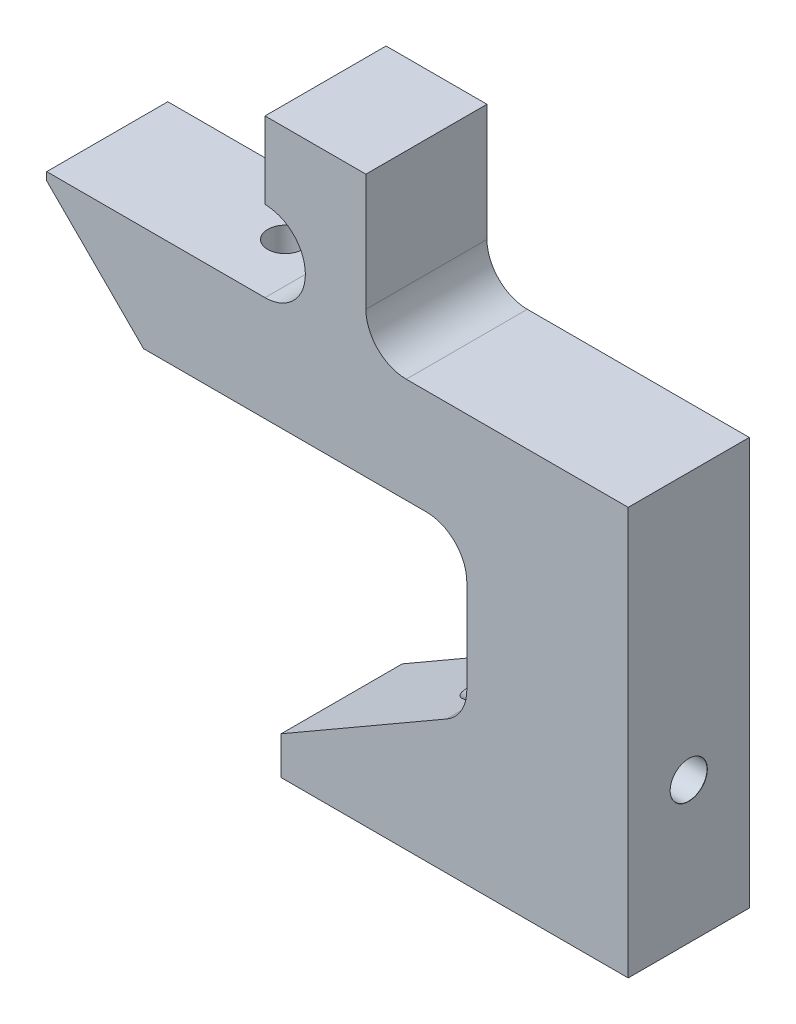
ISO-10303-21;
HEADER;
FILE_DESCRIPTION(('STEP AP214'),'2;1');
FILE_NAME('part.step','',(''),(''),'','','');
FILE_SCHEMA(('AUTOMOTIVE_DESIGN { 1 0 10303 214 1 1 1 1 }'));
ENDSEC;
DATA;
#1=APPLICATION_CONTEXT('core data for automotive mechanical design processes');
#2=APPLICATION_PROTOCOL_DEFINITION('international standard','automotive_design',2000,#1);
#3=PRODUCT_CONTEXT('',#1,'mechanical');
#4=PRODUCT('Part','Part','',(#3));
#5=PRODUCT_RELATED_PRODUCT_CATEGORY('part','',(#4));
#6=PRODUCT_DEFINITION_FORMATION('','',#4);
#7=PRODUCT_DEFINITION_CONTEXT('part definition',#1,'design');
#8=PRODUCT_DEFINITION('design','',#6,#7);
#9=PRODUCT_DEFINITION_SHAPE('','',#8);
#10=(LENGTH_UNIT() NAMED_UNIT(*) SI_UNIT(.MILLI.,.METRE.));
#11=(NAMED_UNIT(*) PLANE_ANGLE_UNIT() SI_UNIT($,.RADIAN.));
#12=(NAMED_UNIT(*) SI_UNIT($,.STERADIAN.) SOLID_ANGLE_UNIT());
#13=UNCERTAINTY_MEASURE_WITH_UNIT(LENGTH_MEASURE(1.E-05),#10,'distance_accuracy_value','');
#14=(GEOMETRIC_REPRESENTATION_CONTEXT(3) GLOBAL_UNCERTAINTY_ASSIGNED_CONTEXT((#13)) GLOBAL_UNIT_ASSIGNED_CONTEXT((#10,
#11,#12)) REPRESENTATION_CONTEXT('',''));
#15=CARTESIAN_POINT('',(0.,0.,0.));
#16=DIRECTION('',(0.,0.,1.));
#17=DIRECTION('',(1.,0.,0.));
#18=AXIS2_PLACEMENT_3D('',#15,#16,#17);
#19=CARTESIAN_POINT('',(82.55,26.035,9.525));
#20=DIRECTION('',(0.,-1.,0.));
#21=DIRECTION('',(1.,0.,0.));
#22=AXIS2_PLACEMENT_3D('',#19,#20,#21);
#23=PLANE('',#22);
#24=CARTESIAN_POINT('',(19.05,26.035,0.));
#25=DIRECTION('',(0.,-1.,0.));
#26=DIRECTION('',(1.,0.,0.));
#27=AXIS2_PLACEMENT_3D('',#24,#25,#26);
#28=CIRCLE('',#27,2.74999999999999);
#29=CARTESIAN_POINT('',(21.8,26.035,0.));
#30=VERTEX_POINT('',#29);
#31=EDGE_CURVE('E53',#30,#30,#28,.T.);
#32=ORIENTED_EDGE('',*,*,#31,.T.);
#33=EDGE_LOOP('',(#32));
#34=FACE_BOUND('',#33,.T.);
#35=DIRECTION('',(-1.,0.,0.));
#36=VECTOR('',#35,1.);
#37=CARTESIAN_POINT('',(82.55,26.035,9.525));
#38=LINE('',#37,#36);
#39=CARTESIAN_POINT('',(25.4,26.035,9.525));
#40=VERTEX_POINT('',#39);
#41=CARTESIAN_POINT('',(-8.94721186379732,26.035,9.525));
#42=VERTEX_POINT('',#41);
#43=EDGE_CURVE('E215',#40,#42,#38,.T.);
#44=ORIENTED_EDGE('',*,*,#43,.F.);
#45=DIRECTION('',(0.,0.,1.));
#46=VECTOR('',#45,1.);
#47=CARTESIAN_POINT('',(25.4,26.035,-38.9413364476272));
#48=LINE('',#47,#46);
#49=CARTESIAN_POINT('',(25.4,26.035,-9.525));
#50=VERTEX_POINT('',#49);
#51=EDGE_CURVE('E214',#50,#40,#48,.T.);
#52=ORIENTED_EDGE('',*,*,#51,.F.);
#53=DIRECTION('',(-1.,0.,0.));
#54=VECTOR('',#53,1.);
#55=CARTESIAN_POINT('',(82.55,26.035,-9.525));
#56=LINE('',#55,#54);
#57=CARTESIAN_POINT('',(-8.94721186379732,26.035,-9.525));
#58=VERTEX_POINT('',#57);
#59=EDGE_CURVE('E197',#50,#58,#56,.T.);
#60=ORIENTED_EDGE('',*,*,#59,.T.);
#61=DIRECTION('',(0.,0.,-1.));
#62=VECTOR('',#61,1.);
#63=CARTESIAN_POINT('',(-8.94721186379732,26.035,9.525));
#64=LINE('',#63,#62);
#65=EDGE_CURVE('E446',#42,#58,#64,.T.);
#66=ORIENTED_EDGE('',*,*,#65,.F.);
#67=EDGE_LOOP('',(#44,#52,#60,#66));
#68=FACE_BOUND('',#67,.T.);
#69=ADVANCED_FACE('F49',(#34,#68),#23,.F.);
#70=CARTESIAN_POINT('',(6.29278813620283,9.525,9.525));
#71=DIRECTION('',(0.,1.,0.));
#72=DIRECTION('',(0.,0.,1.));
#73=AXIS2_PLACEMENT_3D('',#70,#71,#72);
#74=PLANE('',#73);
#75=CARTESIAN_POINT('',(19.05,9.525,0.));
#76=DIRECTION('',(0.,-1.,0.));
#77=DIRECTION('',(0.,0.,-1.));
#78=AXIS2_PLACEMENT_3D('',#75,#76,#77);
#79=CIRCLE('',#78,5.025);
#80=CARTESIAN_POINT('',(19.05,9.525,-5.025));
#81=VERTEX_POINT('',#80);
#82=EDGE_CURVE('E437',#81,#81,#79,.T.);
#83=ORIENTED_EDGE('',*,*,#82,.F.);
#84=EDGE_LOOP('',(#83));
#85=FACE_BOUND('',#84,.T.);
#86=DIRECTION('',(1.,0.,0.));
#87=VECTOR('',#86,1.);
#88=CARTESIAN_POINT('',(0.,9.525,-6.35));
#89=LINE('',#88,#87);
#90=CARTESIAN_POINT('',(6.29278813620283,9.525,-6.34999999999999));
#91=VERTEX_POINT('',#90);
#92=CARTESIAN_POINT('',(50.8,9.525,-6.34999999999999));
#93=VERTEX_POINT('',#92);
#94=EDGE_CURVE('E265',#91,#93,#89,.T.);
#95=ORIENTED_EDGE('',*,*,#94,.T.);
#96=DIRECTION('',(0.,0.,-1.));
#97=VECTOR('',#96,1.);
#98=CARTESIAN_POINT('',(50.8,9.525,9.525));
#99=LINE('',#98,#97);
#100=CARTESIAN_POINT('',(50.8,9.525,9.525));
#101=VERTEX_POINT('',#100);
#102=EDGE_CURVE('E452',#101,#93,#99,.T.);
#103=ORIENTED_EDGE('',*,*,#102,.F.);
#104=DIRECTION('',(1.,0.,0.));
#105=VECTOR('',#104,1.);
#106=CARTESIAN_POINT('',(6.29278813620283,9.525,9.525));
#107=LINE('',#106,#105);
#108=CARTESIAN_POINT('',(6.29278813620283,9.525,9.525));
#109=VERTEX_POINT('',#108);
#110=EDGE_CURVE('E462',#109,#101,#107,.T.);
#111=ORIENTED_EDGE('',*,*,#110,.F.);
#112=DIRECTION('',(0.,0.,-1.));
#113=VECTOR('',#112,1.);
#114=CARTESIAN_POINT('',(6.29278813620283,9.525,9.525));
#115=LINE('',#114,#113);
#116=EDGE_CURVE('E457',#109,#91,#115,.T.);
#117=ORIENTED_EDGE('',*,*,#116,.T.);
#118=EDGE_LOOP('',(#95,#103,#111,#117));
#119=FACE_BOUND('',#118,.T.);
#120=ADVANCED_FACE('F354',(#85,#119),#74,.F.);
#121=CARTESIAN_POINT('',(50.8,3.175,9.525));
#122=DIRECTION('',(0.,0.,-1.));
#123=DIRECTION('',(-1.,0.,0.));
#124=AXIS2_PLACEMENT_3D('',#121,#122,#123);
#125=CYLINDRICAL_SURFACE('',#124,6.35);
#126=CARTESIAN_POINT('',(50.8,3.175,-6.35));
#127=DIRECTION('',(0.,0.,-1.));
#128=DIRECTION('',(-1.,0.,0.));
#129=AXIS2_PLACEMENT_3D('',#126,#127,#128);
#130=CIRCLE('',#129,6.35);
#131=CARTESIAN_POINT('',(57.15,3.175,-6.34999999999999));
#132=VERTEX_POINT('',#131);
#133=EDGE_CURVE('E268',#93,#132,#130,.T.);
#134=ORIENTED_EDGE('',*,*,#133,.T.);
#135=DIRECTION('',(0.,0.,-1.));
#136=VECTOR('',#135,1.);
#137=CARTESIAN_POINT('',(57.15,3.175,9.525));
#138=LINE('',#137,#136);
#139=CARTESIAN_POINT('',(57.15,3.175,9.525));
#140=VERTEX_POINT('',#139);
#141=EDGE_CURVE('E458',#140,#132,#138,.T.);
#142=ORIENTED_EDGE('',*,*,#141,.F.);
#143=CARTESIAN_POINT('',(50.8,3.175,9.525));
#144=DIRECTION('',(0.,0.,-1.));
#145=DIRECTION('',(-1.,0.,0.));
#146=AXIS2_PLACEMENT_3D('',#143,#144,#145);
#147=CIRCLE('',#146,6.35);
#148=EDGE_CURVE('E466',#101,#140,#147,.T.);
#149=ORIENTED_EDGE('',*,*,#148,.F.);
#150=ORIENTED_EDGE('',*,*,#102,.T.);
#151=EDGE_LOOP('',(#134,#142,#149,#150));
#152=FACE_BOUND('',#151,.T.);
#153=ADVANCED_FACE('F362',(#152),#125,.F.);
#154=CARTESIAN_POINT('',(50.8,-11.593094792873,9.525));
#155=DIRECTION('',(0.,0.,-1.));
#156=DIRECTION('',(-1.,0.,0.));
#157=AXIS2_PLACEMENT_3D('',#154,#155,#156);
#158=CYLINDRICAL_SURFACE('',#157,6.35);
#159=CARTESIAN_POINT('',(53.975,-17.0923561069042,4.60428608570136));
#160=CARTESIAN_POINT('',(54.1113508766374,-17.0136414045933,4.62508964887516));
#161=CARTESIAN_POINT('',(54.2448913914641,-16.9297730828273,4.64511225366183));
#162=CARTESIAN_POINT('',(54.5058268645094,-16.751997878483,4.6819390500378));
#163=CARTESIAN_POINT('',(54.6332137589857,-16.6580783163095,4.69873910002061));
#164=CARTESIAN_POINT('',(54.8818400642926,-16.4599753567673,4.72750376481506));
#165=CARTESIAN_POINT('',(55.003029721475,-16.3557241746457,4.73943340216922));
#166=CARTESIAN_POINT('',(55.2374048178985,-16.1381445523192,4.75647541852492));
#167=CARTESIAN_POINT('',(55.35059476805,-16.0248213058547,4.76159166900556));
#168=CARTESIAN_POINT('',(55.5463264474944,-15.8134362028541,4.76302846466305));
#169=CARTESIAN_POINT('',(55.63046672208,-15.7168621875559,4.7609051129015));
#170=CARTESIAN_POINT('',(55.7925866764744,-15.519024406963,4.75021009038339));
#171=CARTESIAN_POINT('',(55.8705677154356,-15.4177616841881,4.74163984667382));
#172=CARTESIAN_POINT('',(56.0196758943345,-15.2116050865912,4.71720819506649));
#173=CARTESIAN_POINT('',(56.0908230061625,-15.1067230909921,4.70136886662639));
#174=CARTESIAN_POINT('',(56.226094755376,-14.8939858242828,4.66162241297098));
#175=CARTESIAN_POINT('',(56.2902194939784,-14.7861305960554,4.63771540405945));
#176=CARTESIAN_POINT('',(56.4115757674052,-14.5677281511387,4.58096849410895));
#177=CARTESIAN_POINT('',(56.4687496606463,-14.4571665022745,4.54806040002896));
#178=CARTESIAN_POINT('',(56.5754116495449,-14.2354894555281,4.4729302555646));
#179=CARTESIAN_POINT('',(56.6248996425662,-14.1243740502716,4.43070808081975));
#180=CARTESIAN_POINT('',(56.7161808387424,-13.9029960870149,4.33671183072896));
#181=CARTESIAN_POINT('',(56.7579726750404,-13.7927336838348,4.2849360619031));
#182=CARTESIAN_POINT('',(56.8340477039572,-13.5745379665484,4.17185512711184));
#183=CARTESIAN_POINT('',(56.8683315315639,-13.4666044561731,4.11055076777488));
#184=CARTESIAN_POINT('',(56.9264952668409,-13.2658985662237,3.98577731950784));
#185=CARTESIAN_POINT('',(56.9510981150687,-13.1727455703258,3.92325300113739));
#186=CARTESIAN_POINT('',(56.9950956957228,-12.9902709148279,3.79109986904151));
#187=CARTESIAN_POINT('',(57.0144882843248,-12.9009508449946,3.72146814709996));
#188=CARTESIAN_POINT('',(57.0485801618721,-12.7269440695261,3.57548014176961));
#189=CARTESIAN_POINT('',(57.063276399359,-12.6422604058874,3.49911952721115));
#190=CARTESIAN_POINT('',(57.0885466129999,-12.4782867137482,3.34017718422799));
#191=CARTESIAN_POINT('',(57.0991203897732,-12.3989969462736,3.2575951551383));
#192=CARTESIAN_POINT('',(57.1163699495852,-12.2498666873862,3.09059466462463));
#193=CARTESIAN_POINT('',(57.1232004809615,-12.1797609557093,3.00642843981754));
#194=CARTESIAN_POINT('',(57.1342262156432,-12.0454423071342,2.83335401028897));
#195=CARTESIAN_POINT('',(57.13842134248,-11.9812295612723,2.74444566805201));
#196=CARTESIAN_POINT('',(57.1447154769834,-11.8592079938995,2.56257298808015));
#197=CARTESIAN_POINT('',(57.1468193381599,-11.8013846224067,2.46961856697297));
#198=CARTESIAN_POINT('',(57.1494582485168,-11.692271159258,2.27995037574595));
#199=CARTESIAN_POINT('',(57.1499935732039,-11.6409799217751,2.18323726884723));
#200=CARTESIAN_POINT('',(57.15,-11.593094792873,2.08487266929629));
#201=B_SPLINE_CURVE_WITH_KNOTS('',3,(#159,#160,#161,#162,#163,#164,#165,#166,#167,#168,#169,
#170,#171,#172,#173,#174,#175,#176,#177,#178,#179,#180,#181,#182,#183,#184,#185,#186,#187,#188,
#189,#190,#191,#192,#193,#194,#195,#196,#197,#198,#199,#200),.UNSPECIFIED.,.F.,.F.,(4,2,2,2,2,2,
2,2,2,2,2,2,2,2,2,2,2,2,2,2,4),(0.,0.476379772374912,0.953367742047326,1.43372342640456,
1.91380604809174,2.29775745889993,2.68162390542814,3.06433201743873,3.44703461255936,
3.83272099070913,4.21841251880887,4.60417248077879,4.98989980458882,5.33407069164746,
5.6783829758579,6.02291852454581,6.36747073444755,6.696430247589,7.02539930533709,
7.35360308069951,7.68174920503093),.UNSPECIFIED.);
#202=CARTESIAN_POINT('',(53.975,-17.0923561069042,4.60428608570136));
#203=VERTEX_POINT('',#202);
#204=CARTESIAN_POINT('',(57.15,-11.593094792873,2.08487266929633));
#205=VERTEX_POINT('',#204);
#206=EDGE_CURVE('E307',#203,#205,#201,.T.);
#207=ORIENTED_EDGE('',*,*,#206,.F.);
#208=DIRECTION('',(0.,0.,-1.));
#209=VECTOR('',#208,1.);
#210=CARTESIAN_POINT('',(53.975,-17.0923561069042,9.525));
#211=LINE('',#210,#209);
#212=CARTESIAN_POINT('',(53.975,-17.0923561069042,9.525));
#213=VERTEX_POINT('',#212);
#214=EDGE_CURVE('E494',#213,#203,#211,.T.);
#215=ORIENTED_EDGE('',*,*,#214,.F.);
#216=CARTESIAN_POINT('',(50.8,-11.593094792873,9.525));
#217=DIRECTION('',(0.,0.,-1.));
#218=DIRECTION('',(-1.,0.,0.));
#219=AXIS2_PLACEMENT_3D('',#216,#217,#218);
#220=CIRCLE('',#219,6.35);
#221=CARTESIAN_POINT('',(57.15,-11.593094792873,9.525));
#222=VERTEX_POINT('',#221);
#223=EDGE_CURVE('E504',#222,#213,#220,.T.);
#224=ORIENTED_EDGE('',*,*,#223,.F.);
#225=DIRECTION('',(0.,0.,-1.));
#226=VECTOR('',#225,1.);
#227=CARTESIAN_POINT('',(57.15,-11.593094792873,9.525));
#228=LINE('',#227,#226);
#229=EDGE_CURVE('E481',#222,#205,#228,.T.);
#230=ORIENTED_EDGE('',*,*,#229,.T.);
#231=EDGE_LOOP('',(#207,#215,#224,#230));
#232=FACE_BOUND('',#231,.T.);
#233=ADVANCED_FACE('F313',(#232),#158,.F.);
#234=CARTESIAN_POINT('',(57.15,-11.593094792873,-2.08487266929629));
#235=CARTESIAN_POINT('',(57.1499896079638,-11.6477036663434,-2.19706000854487));
#236=CARTESIAN_POINT('',(57.149295442611,-11.7067505495997,-2.30709883615113));
#237=CARTESIAN_POINT('',(57.1457738852113,-11.8332961099778,-2.52221696693255));
#238=CARTESIAN_POINT('',(57.1429457661744,-11.9007976608766,-2.62729456696358));
#239=CARTESIAN_POINT('',(57.1343772320195,-12.0439969425765,-2.83204549306916));
#240=CARTESIAN_POINT('',(57.1286284313238,-12.1197177767795,-2.93170233840411));
#241=CARTESIAN_POINT('',(57.1133939144072,-12.2786067084437,-3.1245747462868));
#242=CARTESIAN_POINT('',(57.1039086507198,-12.3617739031131,-3.21779108725592));
#243=CARTESIAN_POINT('',(57.0803422398971,-12.5351551675311,-3.39742198609998));
#244=CARTESIAN_POINT('',(57.0662456746826,-12.6253920946448,-3.48381250154185));
#245=CARTESIAN_POINT('',(57.0326737025964,-12.8118004687659,-3.64879482459787));
#246=CARTESIAN_POINT('',(57.0131986386591,-12.9079715371075,-3.72738712899368));
#247=CARTESIAN_POINT('',(56.9682029671152,-13.105035044801,-3.87606811093338));
#248=CARTESIAN_POINT('',(56.9426946275755,-13.2059175740881,-3.94617361383919));
#249=CARTESIAN_POINT('',(56.8850298855865,-13.4114166067748,-4.07762639548657));
#250=CARTESIAN_POINT('',(56.8528740234818,-13.5160328061112,-4.13897438539856));
#251=CARTESIAN_POINT('',(56.7837993636749,-13.7209030425351,-4.24898938784659));
#252=CARTESIAN_POINT('',(56.7473205959476,-13.8210041883582,-4.29821858822719));
#253=CARTESIAN_POINT('',(56.667991249007,-14.0222666730337,-4.388730959138));
#254=CARTESIAN_POINT('',(56.6251407773086,-14.1234279939702,-4.43001426371868));
#255=CARTESIAN_POINT('',(56.5330307643795,-14.3257142433685,-4.50474723452688));
#256=CARTESIAN_POINT('',(56.4837714841317,-14.4268391731441,-4.53819721959182));
#257=CARTESIAN_POINT('',(56.3789415530392,-14.6280210493351,-4.59754832087161));
#258=CARTESIAN_POINT('',(56.3233708178056,-14.7280779814509,-4.62344933613449));
#259=CARTESIAN_POINT('',(56.2072051739229,-14.9243711737376,-4.66772436778048));
#260=CARTESIAN_POINT('',(56.1467204143452,-15.0206438347441,-4.68622707799075));
#261=CARTESIAN_POINT('',(56.0201375267892,-15.2105094311678,-4.71689631806553));
#262=CARTESIAN_POINT('',(55.9540373588998,-15.3041013761087,-4.72906053379707));
#263=CARTESIAN_POINT('',(55.8164373546782,-15.4881018931541,-4.74766096999691));
#264=CARTESIAN_POINT('',(55.7449270649016,-15.5785037805681,-4.75408577746614));
#265=CARTESIAN_POINT('',(55.5969704685222,-15.7554114050622,-4.76182187389247));
#266=CARTESIAN_POINT('',(55.5205232138835,-15.8419163883809,-4.76313217773545));
#267=CARTESIAN_POINT('',(55.3341426601427,-16.0415685182146,-4.76098271199396));
#268=CARTESIAN_POINT('',(55.2222163043403,-16.1528425293162,-4.75559591355604));
#269=CARTESIAN_POINT('',(54.9906261357071,-16.3665643544675,-4.73827779863016));
#270=CARTESIAN_POINT('',(54.8709575192208,-16.469006595147,-4.7263423840558));
#271=CARTESIAN_POINT('',(54.6253315513067,-16.6639723997066,-4.69772225277613));
#272=CARTESIAN_POINT('',(54.4994083562844,-16.7565426640819,-4.68106139941843));
#273=CARTESIAN_POINT('',(54.2415651757743,-16.931860831255,-4.64461374801886));
#274=CARTESIAN_POINT('',(54.1096531502128,-17.0146212728601,-4.6248310174482));
#275=CARTESIAN_POINT('',(53.975,-17.0923561069042,-4.60428608570135));
#276=B_SPLINE_CURVE_WITH_KNOTS('',3,(#234,#235,#236,#237,#238,#239,#240,#241,#242,#243,#244,
#245,#246,#247,#248,#249,#250,#251,#252,#253,#254,#255,#256,#257,#258,#259,#260,#261,#262,#263,
#264,#265,#266,#267,#268,#269,#270,#271,#272,#273,#274,#275),.UNSPECIFIED.,.F.,.F.,(4,2,2,2,2,2,
2,2,2,2,2,2,2,2,2,2,2,2,2,2,4),(0.,0.374235461788785,0.748598474752093,1.12404244831308,
1.49944096476456,1.87610769504882,2.25275041451625,2.6286337546583,3.00448655309735,
3.35613717554868,3.70778186499156,4.05941223904992,4.41104731522638,4.75626757537123,
5.10161378448363,5.44764520681056,5.79374327560947,6.26685501178745,6.74026315682248,
7.21132191576781,7.68177192717215),.UNSPECIFIED.);
#277=CARTESIAN_POINT('',(57.15,-11.593094792873,-2.08487266929633));
#278=VERTEX_POINT('',#277);
#279=CARTESIAN_POINT('',(53.975,-17.0923561069042,-4.60428608570135));
#280=VERTEX_POINT('',#279);
#281=EDGE_CURVE('E298',#278,#280,#276,.T.);
#282=ORIENTED_EDGE('',*,*,#281,.F.);
#283=CARTESIAN_POINT('',(57.15,-11.593094792873,-9.525));
#284=VERTEX_POINT('',#283);
#285=EDGE_CURVE('E499',#278,#284,#228,.T.);
#286=ORIENTED_EDGE('',*,*,#285,.T.);
#287=CARTESIAN_POINT('',(50.8,-11.593094792873,-9.525));
#288=DIRECTION('',(0.,0.,-1.));
#289=DIRECTION('',(-1.,0.,0.));
#290=AXIS2_PLACEMENT_3D('',#287,#288,#289);
#291=CIRCLE('',#290,6.35);
#292=CARTESIAN_POINT('',(53.975,-17.0923561069042,-9.525));
#293=VERTEX_POINT('',#292);
#294=EDGE_CURVE('E521',#284,#293,#291,.T.);
#295=ORIENTED_EDGE('',*,*,#294,.T.);
#296=EDGE_CURVE('E500',#280,#293,#211,.T.);
#297=ORIENTED_EDGE('',*,*,#296,.F.);
#298=EDGE_LOOP('',(#282,#286,#295,#297));
#299=FACE_BOUND('',#298,.T.);
#300=ADVANCED_FACE('F675',(#299),#158,.F.);
#301=CARTESIAN_POINT('',(27.94,-38.1,9.525));
#302=DIRECTION('',(0.,1.,0.));
#303=DIRECTION('',(0.,0.,1.));
#304=AXIS2_PLACEMENT_3D('',#301,#302,#303);
#305=PLANE('',#304);
#306=DIRECTION('',(1.,0.,0.));
#307=VECTOR('',#306,1.);
#308=CARTESIAN_POINT('',(27.94,-38.1,-9.525));
#309=LINE('',#308,#307);
#310=CARTESIAN_POINT('',(27.94,-38.1,-9.525));
#311=VERTEX_POINT('',#310);
#312=CARTESIAN_POINT('',(82.55,-38.1,-9.525));
#313=VERTEX_POINT('',#312);
#314=EDGE_CURVE('E535',#311,#313,#309,.T.);
#315=ORIENTED_EDGE('',*,*,#314,.T.);
#316=DIRECTION('',(0.,0.,-1.));
#317=VECTOR('',#316,1.);
#318=CARTESIAN_POINT('',(82.55,-38.1,9.525));
#319=LINE('',#318,#317);
#320=CARTESIAN_POINT('',(82.55,-38.1,9.525));
#321=VERTEX_POINT('',#320);
#322=EDGE_CURVE('E399',#321,#313,#319,.T.);
#323=ORIENTED_EDGE('',*,*,#322,.F.);
#324=DIRECTION('',(1.,0.,0.));
#325=VECTOR('',#324,1.);
#326=CARTESIAN_POINT('',(27.94,-38.1,9.525));
#327=LINE('',#326,#325);
#328=CARTESIAN_POINT('',(27.94,-38.1,9.525));
#329=VERTEX_POINT('',#328);
#330=EDGE_CURVE('E550',#329,#321,#327,.T.);
#331=ORIENTED_EDGE('',*,*,#330,.F.);
#332=DIRECTION('',(0.,0.,-1.));
#333=VECTOR('',#332,1.);
#334=CARTESIAN_POINT('',(27.94,-38.1,9.525));
#335=LINE('',#334,#333);
#336=EDGE_CURVE('E560',#329,#311,#335,.T.);
#337=ORIENTED_EDGE('',*,*,#336,.T.);
#338=EDGE_LOOP('',(#315,#323,#331,#337));
#339=FACE_BOUND('',#338,.T.);
#340=ADVANCED_FACE('F378',(#339),#305,.F.);
#341=CARTESIAN_POINT('',(82.55,-38.1,9.525));
#342=DIRECTION('',(-1.,0.,0.));
#343=DIRECTION('',(0.,0.,1.));
#344=AXIS2_PLACEMENT_3D('',#341,#342,#343);
#345=PLANE('',#344);
#346=CARTESIAN_POINT('',(82.55,-15.875,0.));
#347=DIRECTION('',(1.,0.,0.));
#348=DIRECTION('',(0.,0.,-1.));
#349=AXIS2_PLACEMENT_3D('',#346,#347,#348);
#350=CIRCLE('',#349,2.925);
#351=CARTESIAN_POINT('',(82.55,-15.875,-2.925));
#352=VERTEX_POINT('',#351);
#353=EDGE_CURVE('E492',#352,#352,#350,.T.);
#354=ORIENTED_EDGE('',*,*,#353,.F.);
#355=EDGE_LOOP('',(#354));
#356=FACE_BOUND('',#355,.T.);
#357=DIRECTION('',(0.,1.,0.));
#358=VECTOR('',#357,1.);
#359=CARTESIAN_POINT('',(82.55,-38.1,-9.525));
#360=LINE('',#359,#358);
#361=CARTESIAN_POINT('',(82.55,26.035,-9.525));
#362=VERTEX_POINT('',#361);
#363=EDGE_CURVE('E211',#313,#362,#360,.T.);
#364=ORIENTED_EDGE('',*,*,#363,.T.);
#365=DIRECTION('',(0.,0.,-1.));
#366=VECTOR('',#365,1.);
#367=CARTESIAN_POINT('',(82.55,26.035,9.525));
#368=LINE('',#367,#366);
#369=CARTESIAN_POINT('',(82.55,26.035,9.525));
#370=VERTEX_POINT('',#369);
#371=EDGE_CURVE('E388',#370,#362,#368,.T.);
#372=ORIENTED_EDGE('',*,*,#371,.F.);
#373=DIRECTION('',(0.,1.,0.));
#374=VECTOR('',#373,1.);
#375=CARTESIAN_POINT('',(82.55,-38.1,9.525));
#376=LINE('',#375,#374);
#377=EDGE_CURVE('E555',#321,#370,#376,.T.);
#378=ORIENTED_EDGE('',*,*,#377,.F.);
#379=ORIENTED_EDGE('',*,*,#322,.T.);
#380=EDGE_LOOP('',(#364,#372,#378,#379));
#381=FACE_BOUND('',#380,.T.);
#382=ADVANCED_FACE('F370',(#356,#381),#345,.F.);
#383=CARTESIAN_POINT('',(47.625,26.035,-9.525));
#384=VERTEX_POINT('',#383);
#385=EDGE_CURVE('E210',#362,#384,#56,.T.);
#386=ORIENTED_EDGE('',*,*,#385,.T.);
#387=DIRECTION('',(0.,0.,1.));
#388=VECTOR('',#387,1.);
#389=CARTESIAN_POINT('',(47.625,26.035,9.525));
#390=LINE('',#389,#388);
#391=CARTESIAN_POINT('',(47.625,26.035,9.525));
#392=VERTEX_POINT('',#391);
#393=EDGE_CURVE('E386',#384,#392,#390,.T.);
#394=ORIENTED_EDGE('',*,*,#393,.T.);
#395=EDGE_CURVE('E585',#370,#392,#38,.T.);
#396=ORIENTED_EDGE('',*,*,#395,.F.);
#397=ORIENTED_EDGE('',*,*,#371,.T.);
#398=EDGE_LOOP('',(#386,#394,#396,#397));
#399=FACE_BOUND('',#398,.T.);
#400=ADVANCED_FACE('F357',(#399),#23,.F.);
#401=CARTESIAN_POINT('',(-8.94721186379732,26.035,9.525));
#402=DIRECTION('',(1.,0.,0.));
#403=DIRECTION('',(0.,1.,0.));
#404=AXIS2_PLACEMENT_3D('',#401,#402,#403);
#405=PLANE('',#404);
#406=DIRECTION('',(0.,-1.,0.));
#407=VECTOR('',#406,1.);
#408=CARTESIAN_POINT('',(-8.94721186379732,26.035,-9.525));
#409=LINE('',#408,#407);
#410=CARTESIAN_POINT('',(-8.94721186379732,24.765,-9.525));
#411=VERTEX_POINT('',#410);
#412=EDGE_CURVE('E205',#58,#411,#409,.T.);
#413=ORIENTED_EDGE('',*,*,#412,.T.);
#414=DIRECTION('',(0.,0.,-1.));
#415=VECTOR('',#414,1.);
#416=CARTESIAN_POINT('',(-8.94721186379732,24.765,9.525));
#417=LINE('',#416,#415);
#418=CARTESIAN_POINT('',(-8.94721186379732,24.765,9.525));
#419=VERTEX_POINT('',#418);
#420=EDGE_CURVE('E473',#419,#411,#417,.T.);
#421=ORIENTED_EDGE('',*,*,#420,.F.);
#422=DIRECTION('',(0.,-1.,0.));
#423=VECTOR('',#422,1.);
#424=CARTESIAN_POINT('',(-8.94721186379732,26.035,9.525));
#425=LINE('',#424,#423);
#426=EDGE_CURVE('E589',#42,#419,#425,.T.);
#427=ORIENTED_EDGE('',*,*,#426,.F.);
#428=ORIENTED_EDGE('',*,*,#65,.T.);
#429=EDGE_LOOP('',(#413,#421,#427,#428));
#430=FACE_BOUND('',#429,.T.);
#431=ADVANCED_FACE('F369',(#430),#405,.F.);
#432=CARTESIAN_POINT('',(-8.94721186379732,24.765,9.525));
#433=DIRECTION('',(0.707106781186544,0.707106781186551,0.));
#434=DIRECTION('',(-0.707106781186551,0.707106781186544,0.));
#435=AXIS2_PLACEMENT_3D('',#432,#433,#434);
#436=PLANE('',#435);
#437=DIRECTION('',(0.707106781186551,-0.707106781186544,0.));
#438=VECTOR('',#437,1.);
#439=CARTESIAN_POINT('',(-8.94721186379732,24.765,-9.525));
#440=LINE('',#439,#438);
#441=CARTESIAN_POINT('',(8.83278813620267,6.985,-9.52500000000001));
#442=VERTEX_POINT('',#441);
#443=EDGE_CURVE('E594',#411,#442,#440,.T.);
#444=ORIENTED_EDGE('',*,*,#443,.T.);
#445=DIRECTION('',(0.,0.,1.));
#446=VECTOR('',#445,1.);
#447=CARTESIAN_POINT('',(8.83278813620267,6.985,-61.1533652516633));
#448=LINE('',#447,#446);
#449=CARTESIAN_POINT('',(8.83278813620267,6.985,-6.35));
#450=VERTEX_POINT('',#449);
#451=EDGE_CURVE('E259',#442,#450,#448,.T.);
#452=ORIENTED_EDGE('',*,*,#451,.T.);
#453=DIRECTION('',(-0.707106781186525,0.70710678118657,0.));
#454=VECTOR('',#453,1.);
#455=CARTESIAN_POINT('',(7.90889406810161,7.90889406810112,-6.35));
#456=LINE('',#455,#454);
#457=EDGE_CURVE('E261',#450,#91,#456,.T.);
#458=ORIENTED_EDGE('',*,*,#457,.T.);
#459=ORIENTED_EDGE('',*,*,#116,.F.);
#460=DIRECTION('',(0.707106781186551,-0.707106781186544,0.));
#461=VECTOR('',#460,1.);
#462=CARTESIAN_POINT('',(-8.94721186379732,24.765,9.525));
#463=LINE('',#462,#461);
#464=EDGE_CURVE('E467',#419,#109,#463,.T.);
#465=ORIENTED_EDGE('',*,*,#464,.F.);
#466=ORIENTED_EDGE('',*,*,#420,.T.);
#467=EDGE_LOOP('',(#444,#452,#458,#459,#465,#466));
#468=FACE_BOUND('',#467,.T.);
#469=ADVANCED_FACE('F350',(#468),#436,.F.);
#470=CARTESIAN_POINT('',(57.15,3.175,9.525));
#471=DIRECTION('',(1.,0.,0.));
#472=DIRECTION('',(0.,0.,-1.));
#473=AXIS2_PLACEMENT_3D('',#470,#471,#472);
#474=PLANE('',#473);
#475=DIRECTION('',(0.,-1.,0.));
#476=VECTOR('',#475,1.);
#477=CARTESIAN_POINT('',(57.15,1.56125112837913E-13,-6.35));
#478=LINE('',#477,#476);
#479=CARTESIAN_POINT('',(57.15,0.635000000000004,-6.35));
#480=VERTEX_POINT('',#479);
#481=EDGE_CURVE('E271',#132,#480,#478,.T.);
#482=ORIENTED_EDGE('',*,*,#481,.T.);
#483=DIRECTION('',(0.,0.,1.));
#484=VECTOR('',#483,1.);
#485=CARTESIAN_POINT('',(57.15,0.635000000000004,-61.1533652516633));
#486=LINE('',#485,#484);
#487=CARTESIAN_POINT('',(57.15,0.635000000000004,-9.525));
#488=VERTEX_POINT('',#487);
#489=EDGE_CURVE('E287',#488,#480,#486,.T.);
#490=ORIENTED_EDGE('',*,*,#489,.F.);
#491=DIRECTION('',(0.,-1.,0.));
#492=VECTOR('',#491,1.);
#493=CARTESIAN_POINT('',(57.15,3.175,-9.525));
#494=LINE('',#493,#492);
#495=EDGE_CURVE('E527',#488,#284,#494,.T.);
#496=ORIENTED_EDGE('',*,*,#495,.T.);
#497=ORIENTED_EDGE('',*,*,#285,.F.);
#498=CARTESIAN_POINT('',(57.15,-15.875,0.));
#499=DIRECTION('',(1.,0.,0.));
#500=DIRECTION('',(0.,0.,-1.));
#501=AXIS2_PLACEMENT_3D('',#498,#499,#500);
#502=CIRCLE('',#501,4.7625);
#503=EDGE_CURVE('E282',#205,#278,#502,.T.);
#504=ORIENTED_EDGE('',*,*,#503,.F.);
#505=ORIENTED_EDGE('',*,*,#229,.F.);
#506=DIRECTION('',(0.,-1.,0.));
#507=VECTOR('',#506,1.);
#508=CARTESIAN_POINT('',(57.15,3.175,9.525));
#509=LINE('',#508,#507);
#510=EDGE_CURVE('E486',#140,#222,#509,.T.);
#511=ORIENTED_EDGE('',*,*,#510,.F.);
#512=ORIENTED_EDGE('',*,*,#141,.T.);
#513=EDGE_LOOP('',(#482,#490,#496,#497,#504,#505,#511,#512));
#514=FACE_BOUND('',#513,.T.);
#515=CARTESIAN_POINT('',(57.15,-15.875,0.));
#516=DIRECTION('',(1.,0.,0.));
#517=DIRECTION('',(0.,0.,-1.));
#518=AXIS2_PLACEMENT_3D('',#515,#516,#517);
#519=CIRCLE('',#518,2.89999999999998);
#520=CARTESIAN_POINT('',(57.15,-15.875,-2.89999999999998));
#521=VERTEX_POINT('',#520);
#522=EDGE_CURVE('E297',#521,#521,#519,.F.);
#523=ORIENTED_EDGE('',*,*,#522,.F.);
#524=EDGE_LOOP('',(#523));
#525=FACE_BOUND('',#524,.T.);
#526=ADVANCED_FACE('F344',(#514,#525),#474,.F.);
#527=CARTESIAN_POINT('',(53.975,-17.0923561069042,9.525));
#528=DIRECTION('',(0.500000000000001,-0.866025403784438,0.));
#529=DIRECTION('',(0.866025403784438,0.500000000000001,0.));
#530=AXIS2_PLACEMENT_3D('',#527,#528,#529);
#531=PLANE('',#530);
#532=CARTESIAN_POINT('',(56.0835226280623,-15.875,0.));
#533=DIRECTION('',(0.500000000000001,-0.866025403784438,0.));
#534=DIRECTION('',(-0.866025403784438,-0.500000000000001,0.));
#535=AXIS2_PLACEMENT_3D('',#532,#533,#534);
#536=ELLIPSE('',#535,9.52499999999998,4.7625);
#537=EDGE_CURVE('E393',#280,#203,#536,.F.);
#538=ORIENTED_EDGE('',*,*,#537,.F.);
#539=ORIENTED_EDGE('',*,*,#296,.T.);
#540=DIRECTION('',(-0.866025403784438,-0.500000000000001,0.));
#541=VECTOR('',#540,1.);
#542=CARTESIAN_POINT('',(53.975,-17.0923561069042,-9.525));
#543=LINE('',#542,#541);
#544=CARTESIAN_POINT('',(27.94,-32.1236703652562,-9.525));
#545=VERTEX_POINT('',#544);
#546=EDGE_CURVE('E526',#293,#545,#543,.T.);
#547=ORIENTED_EDGE('',*,*,#546,.T.);
#548=DIRECTION('',(0.,0.,-1.));
#549=VECTOR('',#548,1.);
#550=CARTESIAN_POINT('',(27.94,-32.1236703652562,9.525));
#551=LINE('',#550,#549);
#552=CARTESIAN_POINT('',(27.94,-32.1236703652562,9.525));
#553=VERTEX_POINT('',#552);
#554=EDGE_CURVE('E533',#553,#545,#551,.T.);
#555=ORIENTED_EDGE('',*,*,#554,.F.);
#556=DIRECTION('',(-0.866025403784438,-0.500000000000001,0.));
#557=VECTOR('',#556,1.);
#558=CARTESIAN_POINT('',(53.975,-17.0923561069042,9.525));
#559=LINE('',#558,#557);
#560=EDGE_CURVE('E508',#213,#553,#559,.T.);
#561=ORIENTED_EDGE('',*,*,#560,.F.);
#562=ORIENTED_EDGE('',*,*,#214,.T.);
#563=EDGE_LOOP('',(#538,#539,#547,#555,#561,#562));
#564=FACE_BOUND('',#563,.T.);
#565=ADVANCED_FACE('F341',(#564),#531,.F.);
#566=CARTESIAN_POINT('',(27.94,-32.1236703652562,9.525));
#567=DIRECTION('',(1.,0.,0.));
#568=DIRECTION('',(0.,1.,0.));
#569=AXIS2_PLACEMENT_3D('',#566,#567,#568);
#570=PLANE('',#569);
#571=DIRECTION('',(0.,-1.,0.));
#572=VECTOR('',#571,1.);
#573=CARTESIAN_POINT('',(27.94,-32.1236703652562,-9.525));
#574=LINE('',#573,#572);
#575=EDGE_CURVE('E556',#545,#311,#574,.T.);
#576=ORIENTED_EDGE('',*,*,#575,.T.);
#577=ORIENTED_EDGE('',*,*,#336,.F.);
#578=DIRECTION('',(0.,-1.,0.));
#579=VECTOR('',#578,1.);
#580=CARTESIAN_POINT('',(27.94,-32.1236703652562,9.525));
#581=LINE('',#580,#579);
#582=EDGE_CURVE('E565',#553,#329,#581,.T.);
#583=ORIENTED_EDGE('',*,*,#582,.F.);
#584=ORIENTED_EDGE('',*,*,#554,.T.);
#585=EDGE_LOOP('',(#576,#577,#583,#584));
#586=FACE_BOUND('',#585,.T.);
#587=ADVANCED_FACE('F337',(#586),#570,.F.);
#588=CARTESIAN_POINT('',(50.8,3.175,9.525));
#589=DIRECTION('',(0.,0.,-1.));
#590=DIRECTION('',(-1.,0.,0.));
#591=AXIS2_PLACEMENT_3D('',#588,#589,#590);
#592=PLANE('',#591);
#593=ORIENTED_EDGE('',*,*,#330,.T.);
#594=ORIENTED_EDGE('',*,*,#377,.T.);
#595=ORIENTED_EDGE('',*,*,#395,.T.);
#596=CARTESIAN_POINT('',(47.625,32.385,9.525));
#597=DIRECTION('',(0.,0.,-1.));
#598=DIRECTION('',(-1.,0.,0.));
#599=AXIS2_PLACEMENT_3D('',#596,#597,#598);
#600=CIRCLE('',#599,6.35);
#601=CARTESIAN_POINT('',(41.275,32.385,9.525));
#602=VERTEX_POINT('',#601);
#603=EDGE_CURVE('E59',#392,#602,#600,.T.);
#604=ORIENTED_EDGE('',*,*,#603,.T.);
#605=DIRECTION('',(0.,1.,0.));
#606=VECTOR('',#605,1.);
#607=CARTESIAN_POINT('',(41.275,3.175,9.525));
#608=LINE('',#607,#606);
#609=CARTESIAN_POINT('',(41.275,50.8,9.525));
#610=VERTEX_POINT('',#609);
#611=EDGE_CURVE('E226',#602,#610,#608,.T.);
#612=ORIENTED_EDGE('',*,*,#611,.T.);
#613=DIRECTION('',(1.,0.,0.));
#614=VECTOR('',#613,1.);
#615=CARTESIAN_POINT('',(50.8,50.8,9.525));
#616=LINE('',#615,#614);
#617=CARTESIAN_POINT('',(25.4,50.8,9.525));
#618=VERTEX_POINT('',#617);
#619=EDGE_CURVE('E249',#618,#610,#616,.T.);
#620=ORIENTED_EDGE('',*,*,#619,.F.);
#621=DIRECTION('',(0.,1.,0.));
#622=VECTOR('',#621,1.);
#623=CARTESIAN_POINT('',(25.4,3.175,9.525));
#624=LINE('',#623,#622);
#625=CARTESIAN_POINT('',(25.4,38.735,9.525));
#626=VERTEX_POINT('',#625);
#627=EDGE_CURVE('E234',#626,#618,#624,.T.);
#628=ORIENTED_EDGE('',*,*,#627,.F.);
#629=CARTESIAN_POINT('',(25.4,32.385,9.525));
#630=DIRECTION('',(0.,0.,-1.));
#631=DIRECTION('',(-1.,0.,0.));
#632=AXIS2_PLACEMENT_3D('',#629,#630,#631);
#633=CIRCLE('',#632,6.35);
#634=EDGE_CURVE('E230',#626,#40,#633,.T.);
#635=ORIENTED_EDGE('',*,*,#634,.T.);
#636=ORIENTED_EDGE('',*,*,#43,.T.);
#637=ORIENTED_EDGE('',*,*,#426,.T.);
#638=ORIENTED_EDGE('',*,*,#464,.T.);
#639=ORIENTED_EDGE('',*,*,#110,.T.);
#640=ORIENTED_EDGE('',*,*,#148,.T.);
#641=ORIENTED_EDGE('',*,*,#510,.T.);
#642=ORIENTED_EDGE('',*,*,#223,.T.);
#643=ORIENTED_EDGE('',*,*,#560,.T.);
#644=ORIENTED_EDGE('',*,*,#582,.T.);
#645=EDGE_LOOP('',(#593,#594,#595,#604,#612,#620,#628,#635,#636,#637,#638,#639,#640,#641,#642,
#643,#644));
#646=FACE_BOUND('',#645,.T.);
#647=ADVANCED_FACE('F334',(#646),#592,.F.);
#648=CARTESIAN_POINT('',(50.8,3.175,-9.525));
#649=DIRECTION('',(0.,0.,-1.));
#650=DIRECTION('',(-1.,0.,0.));
#651=AXIS2_PLACEMENT_3D('',#648,#649,#650);
#652=PLANE('',#651);
#653=ORIENTED_EDGE('',*,*,#314,.F.);
#654=ORIENTED_EDGE('',*,*,#575,.F.);
#655=ORIENTED_EDGE('',*,*,#546,.F.);
#656=ORIENTED_EDGE('',*,*,#294,.F.);
#657=ORIENTED_EDGE('',*,*,#495,.F.);
#658=CARTESIAN_POINT('',(50.8,0.635000000000004,-9.525));
#659=DIRECTION('',(0.,0.,-1.));
#660=DIRECTION('',(-1.,0.,0.));
#661=AXIS2_PLACEMENT_3D('',#658,#659,#660);
#662=CIRCLE('',#661,6.35);
#663=CARTESIAN_POINT('',(50.8,6.985,-9.52500000000001));
#664=VERTEX_POINT('',#663);
#665=EDGE_CURVE('E283',#664,#488,#662,.T.);
#666=ORIENTED_EDGE('',*,*,#665,.F.);
#667=DIRECTION('',(-1.,0.,0.));
#668=VECTOR('',#667,1.);
#669=CARTESIAN_POINT('',(0.,6.985,-9.525));
#670=LINE('',#669,#668);
#671=EDGE_CURVE('E278',#664,#442,#670,.T.);
#672=ORIENTED_EDGE('',*,*,#671,.T.);
#673=ORIENTED_EDGE('',*,*,#443,.F.);
#674=ORIENTED_EDGE('',*,*,#412,.F.);
#675=ORIENTED_EDGE('',*,*,#59,.F.);
#676=CARTESIAN_POINT('',(25.4,32.385,-9.525));
#677=DIRECTION('',(0.,0.,-1.));
#678=DIRECTION('',(-1.,0.,0.));
#679=AXIS2_PLACEMENT_3D('',#676,#677,#678);
#680=CIRCLE('',#679,6.35);
#681=CARTESIAN_POINT('',(25.4,38.735,-9.525));
#682=VERTEX_POINT('',#681);
#683=EDGE_CURVE('E202',#682,#50,#680,.T.);
#684=ORIENTED_EDGE('',*,*,#683,.F.);
#685=DIRECTION('',(0.,1.,0.));
#686=VECTOR('',#685,1.);
#687=CARTESIAN_POINT('',(25.4,3.175,-9.525));
#688=LINE('',#687,#686);
#689=CARTESIAN_POINT('',(25.4,50.8,-9.525));
#690=VERTEX_POINT('',#689);
#691=EDGE_CURVE('E236',#682,#690,#688,.T.);
#692=ORIENTED_EDGE('',*,*,#691,.T.);
#693=DIRECTION('',(1.,0.,0.));
#694=VECTOR('',#693,1.);
#695=CARTESIAN_POINT('',(50.8,50.8,-9.525));
#696=LINE('',#695,#694);
#697=CARTESIAN_POINT('',(41.275,50.8,-9.525));
#698=VERTEX_POINT('',#697);
#699=EDGE_CURVE('E239',#690,#698,#696,.T.);
#700=ORIENTED_EDGE('',*,*,#699,.T.);
#701=DIRECTION('',(0.,1.,0.));
#702=VECTOR('',#701,1.);
#703=CARTESIAN_POINT('',(41.275,3.175,-9.525));
#704=LINE('',#703,#702);
#705=CARTESIAN_POINT('',(41.275,32.385,-9.525));
#706=VERTEX_POINT('',#705);
#707=EDGE_CURVE('E220',#706,#698,#704,.T.);
#708=ORIENTED_EDGE('',*,*,#707,.F.);
#709=CARTESIAN_POINT('',(47.625,32.385,-9.525));
#710=DIRECTION('',(0.,0.,-1.));
#711=DIRECTION('',(-1.,0.,0.));
#712=AXIS2_PLACEMENT_3D('',#709,#710,#711);
#713=CIRCLE('',#712,6.35);
#714=EDGE_CURVE('E11',#706,#384,#713,.F.);
#715=ORIENTED_EDGE('',*,*,#714,.T.);
#716=ORIENTED_EDGE('',*,*,#385,.F.);
#717=ORIENTED_EDGE('',*,*,#363,.F.);
#718=EDGE_LOOP('',(#653,#654,#655,#656,#657,#666,#672,#673,#674,#675,#684,#692,#700,#708,#715,
#716,#717));
#719=FACE_BOUND('',#718,.T.);
#720=ADVANCED_FACE('F200',(#719),#652,.T.);
#721=CARTESIAN_POINT('',(82.55,-15.875,0.));
#722=DIRECTION('',(1.,0.,0.));
#723=DIRECTION('',(0.,0.,-1.));
#724=AXIS2_PLACEMENT_3D('',#721,#722,#723);
#725=CYLINDRICAL_SURFACE('',#724,2.89999999999998);
#726=ORIENTED_EDGE('',*,*,#522,.T.);
#727=EDGE_LOOP('',(#726));
#728=FACE_BOUND('',#727,.T.);
#729=CARTESIAN_POINT('',(82.525,-15.875,0.));
#730=DIRECTION('',(1.,0.,0.));
#731=DIRECTION('',(0.,0.,-1.));
#732=AXIS2_PLACEMENT_3D('',#729,#730,#731);
#733=CIRCLE('',#732,2.89999999999998);
#734=CARTESIAN_POINT('',(82.525,-15.875,-2.89999999999998));
#735=VERTEX_POINT('',#734);
#736=EDGE_CURVE('E540',#735,#735,#733,.T.);
#737=ORIENTED_EDGE('',*,*,#736,.T.);
#738=EDGE_LOOP('',(#737));
#739=FACE_BOUND('',#738,.T.);
#740=ADVANCED_FACE('F329',(#728,#739),#725,.F.);
#741=CARTESIAN_POINT('',(82.55,-15.875,0.));
#742=DIRECTION('',(1.,0.,0.));
#743=DIRECTION('',(0.,0.,-1.));
#744=AXIS2_PLACEMENT_3D('',#741,#742,#743);
#745=CONICAL_SURFACE('',#744,2.925,0.785398163397275);
#746=ORIENTED_EDGE('',*,*,#736,.F.);
#747=EDGE_LOOP('',(#746));
#748=FACE_BOUND('',#747,.T.);
#749=ORIENTED_EDGE('',*,*,#353,.T.);
#750=EDGE_LOOP('',(#749));
#751=FACE_BOUND('',#750,.T.);
#752=ADVANCED_FACE('F323',(#748,#751),#745,.F.);
#753=CARTESIAN_POINT('',(70.6203841816037,-15.875,0.));
#754=DIRECTION('',(-1.,0.,0.));
#755=DIRECTION('',(0.,0.,1.));
#756=AXIS2_PLACEMENT_3D('',#753,#754,#755);
#757=CYLINDRICAL_SURFACE('',#756,4.7625);
#758=ORIENTED_EDGE('',*,*,#206,.T.);
#759=ORIENTED_EDGE('',*,*,#503,.T.);
#760=ORIENTED_EDGE('',*,*,#281,.T.);
#761=ORIENTED_EDGE('',*,*,#537,.T.);
#762=EDGE_LOOP('',(#758,#759,#760,#761));
#763=FACE_BOUND('',#762,.T.);
#764=ADVANCED_FACE('F317',(#763),#757,.F.);
#765=CARTESIAN_POINT('',(50.8,0.635000000000004,-61.1533652516633));
#766=DIRECTION('',(0.,0.,1.));
#767=DIRECTION('',(1.,0.,0.));
#768=AXIS2_PLACEMENT_3D('',#765,#766,#767);
#769=CYLINDRICAL_SURFACE('',#768,6.35);
#770=DIRECTION('',(0.,0.,1.));
#771=VECTOR('',#770,1.);
#772=CARTESIAN_POINT('',(50.8,6.985,-61.1533652516633));
#773=LINE('',#772,#771);
#774=CARTESIAN_POINT('',(50.8,6.985,-6.35));
#775=VERTEX_POINT('',#774);
#776=EDGE_CURVE('E260',#664,#775,#773,.T.);
#777=ORIENTED_EDGE('',*,*,#776,.F.);
#778=ORIENTED_EDGE('',*,*,#665,.T.);
#779=ORIENTED_EDGE('',*,*,#489,.T.);
#780=CARTESIAN_POINT('',(50.8,0.635000000000004,-6.35));
#781=DIRECTION('',(0.,0.,-1.));
#782=DIRECTION('',(-1.,0.,0.));
#783=AXIS2_PLACEMENT_3D('',#780,#781,#782);
#784=CIRCLE('',#783,6.35);
#785=EDGE_CURVE('E274',#775,#480,#784,.T.);
#786=ORIENTED_EDGE('',*,*,#785,.F.);
#787=EDGE_LOOP('',(#777,#778,#779,#786));
#788=FACE_BOUND('',#787,.T.);
#789=ADVANCED_FACE('F322',(#788),#769,.F.);
#790=CARTESIAN_POINT('',(0.,6.985,-61.1533652516633));
#791=DIRECTION('',(0.,1.,0.));
#792=DIRECTION('',(0.,0.,1.));
#793=AXIS2_PLACEMENT_3D('',#790,#791,#792);
#794=PLANE('',#793);
#795=ORIENTED_EDGE('',*,*,#671,.F.);
#796=ORIENTED_EDGE('',*,*,#776,.T.);
#797=DIRECTION('',(-1.,0.,0.));
#798=VECTOR('',#797,1.);
#799=CARTESIAN_POINT('',(0.,6.985,-6.35));
#800=LINE('',#799,#798);
#801=EDGE_CURVE('E255',#775,#450,#800,.T.);
#802=ORIENTED_EDGE('',*,*,#801,.T.);
#803=ORIENTED_EDGE('',*,*,#451,.F.);
#804=EDGE_LOOP('',(#795,#796,#802,#803));
#805=FACE_BOUND('',#804,.T.);
#806=ADVANCED_FACE('F686',(#805),#794,.F.);
#807=CARTESIAN_POINT('',(50.8,0.635000000000004,-6.35));
#808=DIRECTION('',(0.,0.,-1.));
#809=DIRECTION('',(-1.,0.,0.));
#810=AXIS2_PLACEMENT_3D('',#807,#808,#809);
#811=PLANE('',#810);
#812=ORIENTED_EDGE('',*,*,#785,.T.);
#813=ORIENTED_EDGE('',*,*,#481,.F.);
#814=ORIENTED_EDGE('',*,*,#133,.F.);
#815=ORIENTED_EDGE('',*,*,#94,.F.);
#816=ORIENTED_EDGE('',*,*,#457,.F.);
#817=ORIENTED_EDGE('',*,*,#801,.F.);
#818=EDGE_LOOP('',(#812,#813,#814,#815,#816,#817));
#819=FACE_BOUND('',#818,.T.);
#820=ADVANCED_FACE('F805',(#819),#811,.F.);
#821=CARTESIAN_POINT('',(25.4,32.385,-38.9413364476272));
#822=DIRECTION('',(0.,0.,1.));
#823=DIRECTION('',(1.,0.,0.));
#824=AXIS2_PLACEMENT_3D('',#821,#822,#823);
#825=CYLINDRICAL_SURFACE('',#824,6.35);
#826=DIRECTION('',(0.,0.,1.));
#827=VECTOR('',#826,1.);
#828=CARTESIAN_POINT('',(25.4,38.735,-38.9413364476272));
#829=LINE('',#828,#827);
#830=EDGE_CURVE('E224',#682,#626,#829,.T.);
#831=ORIENTED_EDGE('',*,*,#830,.F.);
#832=ORIENTED_EDGE('',*,*,#683,.T.);
#833=ORIENTED_EDGE('',*,*,#51,.T.);
#834=ORIENTED_EDGE('',*,*,#634,.F.);
#835=EDGE_LOOP('',(#831,#832,#833,#834));
#836=FACE_BOUND('',#835,.T.);
#837=ADVANCED_FACE('F223',(#836),#825,.F.);
#838=CARTESIAN_POINT('',(41.275,3.175,-38.9413364476272));
#839=DIRECTION('',(1.,0.,0.));
#840=DIRECTION('',(0.,0.,-1.));
#841=AXIS2_PLACEMENT_3D('',#838,#839,#840);
#842=PLANE('',#841);
#843=ORIENTED_EDGE('',*,*,#611,.F.);
#844=DIRECTION('',(0.,0.,1.));
#845=VECTOR('',#844,1.);
#846=CARTESIAN_POINT('',(41.275,32.385,-38.9413364476272));
#847=LINE('',#846,#845);
#848=EDGE_CURVE('E72',#602,#706,#847,.F.);
#849=ORIENTED_EDGE('',*,*,#848,.T.);
#850=ORIENTED_EDGE('',*,*,#707,.T.);
#851=DIRECTION('',(0.,0.,1.));
#852=VECTOR('',#851,1.);
#853=CARTESIAN_POINT('',(41.275,50.8,-38.9413364476272));
#854=LINE('',#853,#852);
#855=EDGE_CURVE('E245',#698,#610,#854,.T.);
#856=ORIENTED_EDGE('',*,*,#855,.T.);
#857=EDGE_LOOP('',(#843,#849,#850,#856));
#858=FACE_BOUND('',#857,.T.);
#859=ADVANCED_FACE('F781',(#858),#842,.T.);
#860=CARTESIAN_POINT('',(50.8,50.8,-38.9413364476272));
#861=DIRECTION('',(0.,-1.,0.));
#862=DIRECTION('',(0.,0.,-1.));
#863=AXIS2_PLACEMENT_3D('',#860,#861,#862);
#864=PLANE('',#863);
#865=ORIENTED_EDGE('',*,*,#699,.F.);
#866=DIRECTION('',(0.,0.,1.));
#867=VECTOR('',#866,1.);
#868=CARTESIAN_POINT('',(25.4,50.8,-38.9413364476272));
#869=LINE('',#868,#867);
#870=EDGE_CURVE('E246',#690,#618,#869,.T.);
#871=ORIENTED_EDGE('',*,*,#870,.T.);
#872=ORIENTED_EDGE('',*,*,#619,.T.);
#873=ORIENTED_EDGE('',*,*,#855,.F.);
#874=EDGE_LOOP('',(#865,#871,#872,#873));
#875=FACE_BOUND('',#874,.T.);
#876=ADVANCED_FACE('F785',(#875),#864,.F.);
#877=CARTESIAN_POINT('',(25.4,3.175,-38.9413364476272));
#878=DIRECTION('',(1.,0.,0.));
#879=DIRECTION('',(0.,0.,-1.));
#880=AXIS2_PLACEMENT_3D('',#877,#878,#879);
#881=PLANE('',#880);
#882=ORIENTED_EDGE('',*,*,#691,.F.);
#883=ORIENTED_EDGE('',*,*,#830,.T.);
#884=ORIENTED_EDGE('',*,*,#627,.T.);
#885=ORIENTED_EDGE('',*,*,#870,.F.);
#886=EDGE_LOOP('',(#882,#883,#884,#885));
#887=FACE_BOUND('',#886,.T.);
#888=ADVANCED_FACE('F795',(#887),#881,.F.);
#889=CARTESIAN_POINT('',(47.625,32.385,9.525));
#890=DIRECTION('',(0.,0.,1.));
#891=DIRECTION('',(1.,0.,0.));
#892=AXIS2_PLACEMENT_3D('',#889,#890,#891);
#893=CYLINDRICAL_SURFACE('',#892,6.35);
#894=ORIENTED_EDGE('',*,*,#714,.F.);
#895=ORIENTED_EDGE('',*,*,#848,.F.);
#896=ORIENTED_EDGE('',*,*,#603,.F.);
#897=ORIENTED_EDGE('',*,*,#393,.F.);
#898=EDGE_LOOP('',(#894,#895,#896,#897));
#899=FACE_BOUND('',#898,.T.);
#900=ADVANCED_FACE('F51',(#899),#893,.F.);
#901=CARTESIAN_POINT('',(19.05,9.525,0.));
#902=DIRECTION('',(0.,-1.,0.));
#903=DIRECTION('',(0.,0.,-1.));
#904=AXIS2_PLACEMENT_3D('',#901,#902,#903);
#905=CYLINDRICAL_SURFACE('',#904,2.74999999999999);
#906=CARTESIAN_POINT('',(19.05,14.525,0.));
#907=DIRECTION('',(0.,-1.,0.));
#908=DIRECTION('',(0.,0.,-1.));
#909=AXIS2_PLACEMENT_3D('',#906,#907,#908);
#910=CIRCLE('',#909,2.75);
#911=CARTESIAN_POINT('',(19.05,14.525,-2.75));
#912=VERTEX_POINT('',#911);
#913=EDGE_CURVE('E420',#912,#912,#910,.T.);
#914=ORIENTED_EDGE('',*,*,#913,.T.);
#915=EDGE_LOOP('',(#914));
#916=FACE_BOUND('',#915,.T.);
#917=ORIENTED_EDGE('',*,*,#31,.F.);
#918=EDGE_LOOP('',(#917));
#919=FACE_BOUND('',#918,.T.);
#920=ADVANCED_FACE('F845',(#916,#919),#905,.F.);
#921=CARTESIAN_POINT('',(24.05,14.525,0.));
#922=DIRECTION('',(0.,1.,0.));
#923=DIRECTION('',(0.,0.,1.));
#924=AXIS2_PLACEMENT_3D('',#921,#922,#923);
#925=PLANE('',#924);
#926=ORIENTED_EDGE('',*,*,#913,.F.);
#927=EDGE_LOOP('',(#926));
#928=FACE_BOUND('',#927,.T.);
#929=CARTESIAN_POINT('',(19.05,14.525,0.));
#930=DIRECTION('',(0.,-1.,0.));
#931=DIRECTION('',(0.,0.,-1.));
#932=AXIS2_PLACEMENT_3D('',#929,#930,#931);
#933=CIRCLE('',#932,5.);
#934=CARTESIAN_POINT('',(19.05,14.525,-5.));
#935=VERTEX_POINT('',#934);
#936=EDGE_CURVE('E425',#935,#935,#933,.T.);
#937=ORIENTED_EDGE('',*,*,#936,.T.);
#938=EDGE_LOOP('',(#937));
#939=FACE_BOUND('',#938,.T.);
#940=ADVANCED_FACE('F854',(#928,#939),#925,.F.);
#941=CARTESIAN_POINT('',(19.05,9.525,0.));
#942=DIRECTION('',(0.,-1.,0.));
#943=DIRECTION('',(0.,0.,-1.));
#944=AXIS2_PLACEMENT_3D('',#941,#942,#943);
#945=CYLINDRICAL_SURFACE('',#944,5.);
#946=ORIENTED_EDGE('',*,*,#936,.F.);
#947=EDGE_LOOP('',(#946));
#948=FACE_BOUND('',#947,.T.);
#949=CARTESIAN_POINT('',(19.05,9.55,0.));
#950=DIRECTION('',(0.,-1.,0.));
#951=DIRECTION('',(0.,0.,-1.));
#952=AXIS2_PLACEMENT_3D('',#949,#950,#951);
#953=CIRCLE('',#952,5.);
#954=CARTESIAN_POINT('',(19.05,9.55,-5.));
#955=VERTEX_POINT('',#954);
#956=EDGE_CURVE('E432',#955,#955,#953,.T.);
#957=ORIENTED_EDGE('',*,*,#956,.T.);
#958=EDGE_LOOP('',(#957));
#959=FACE_BOUND('',#958,.T.);
#960=ADVANCED_FACE('F865',(#948,#959),#945,.F.);
#961=CARTESIAN_POINT('',(19.05,9.525,0.));
#962=DIRECTION('',(0.,-1.,0.));
#963=DIRECTION('',(0.,0.,-1.));
#964=AXIS2_PLACEMENT_3D('',#961,#962,#963);
#965=CONICAL_SURFACE('',#964,5.025,0.785398163397483);
#966=ORIENTED_EDGE('',*,*,#956,.F.);
#967=EDGE_LOOP('',(#966));
#968=FACE_BOUND('',#967,.T.);
#969=ORIENTED_EDGE('',*,*,#82,.T.);
#970=EDGE_LOOP('',(#969));
#971=FACE_BOUND('',#970,.T.);
#972=ADVANCED_FACE('F875',(#968,#971),#965,.F.);
#973=CLOSED_SHELL('',(#69,#120,#153,#233,#300,#340,#382,#400,#431,#469,#526,#565,#587,#647,#720,
#740,#752,#764,#789,#806,#820,#837,#859,#876,#888,#900,#920,#940,#960,#972));
#974=MANIFOLD_SOLID_BREP('B2',#973);
#975=ADVANCED_BREP_SHAPE_REPRESENTATION('',(#18,#974),#14);
#976=SHAPE_DEFINITION_REPRESENTATION(#9,#975);
ENDSEC;
END-ISO-10303-21;
